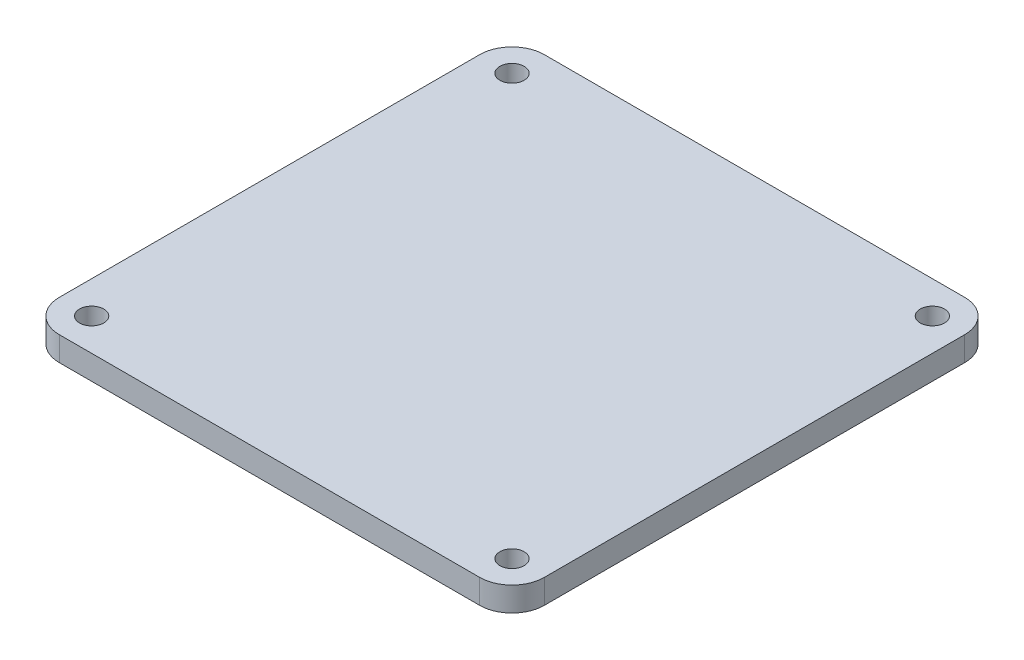
ISO-10303-21;
HEADER;
FILE_DESCRIPTION(('STEP AP214'),'2;1');
FILE_NAME('part.step','',(''),(''),'','','');
FILE_SCHEMA(('AUTOMOTIVE_DESIGN { 1 0 10303 214 1 1 1 1 }'));
ENDSEC;
DATA;
#1=APPLICATION_CONTEXT('core data for automotive mechanical design processes');
#2=APPLICATION_PROTOCOL_DEFINITION('international standard','automotive_design',2000,#1);
#3=PRODUCT_CONTEXT('',#1,'mechanical');
#4=PRODUCT('Part','Part','',(#3));
#5=PRODUCT_RELATED_PRODUCT_CATEGORY('part','',(#4));
#6=PRODUCT_DEFINITION_FORMATION('','',#4);
#7=PRODUCT_DEFINITION_CONTEXT('part definition',#1,'design');
#8=PRODUCT_DEFINITION('design','',#6,#7);
#9=PRODUCT_DEFINITION_SHAPE('','',#8);
#10=(LENGTH_UNIT() NAMED_UNIT(*) SI_UNIT(.MILLI.,.METRE.));
#11=(NAMED_UNIT(*) PLANE_ANGLE_UNIT() SI_UNIT($,.RADIAN.));
#12=(NAMED_UNIT(*) SI_UNIT($,.STERADIAN.) SOLID_ANGLE_UNIT());
#13=UNCERTAINTY_MEASURE_WITH_UNIT(LENGTH_MEASURE(1.E-05),#10,'distance_accuracy_value','');
#14=(GEOMETRIC_REPRESENTATION_CONTEXT(3) GLOBAL_UNCERTAINTY_ASSIGNED_CONTEXT((#13)) GLOBAL_UNIT_ASSIGNED_CONTEXT((#10,
#11,#12)) REPRESENTATION_CONTEXT('',''));
#15=CARTESIAN_POINT('',(0.,0.,0.));
#16=DIRECTION('',(0.,0.,1.));
#17=DIRECTION('',(1.,0.,0.));
#18=AXIS2_PLACEMENT_3D('',#15,#16,#17);
#19=CARTESIAN_POINT('',(-26.,3.,26.));
#20=DIRECTION('',(0.,-1.,0.));
#21=DIRECTION('',(0.,0.,-1.));
#22=AXIS2_PLACEMENT_3D('',#19,#20,#21);
#23=PLANE('',#22);
#24=CARTESIAN_POINT('',(-26.,3.,26.));
#25=DIRECTION('',(0.,1.,0.));
#26=DIRECTION('',(0.,0.,-1.));
#27=AXIS2_PLACEMENT_3D('',#24,#25,#26);
#28=CIRCLE('',#27,4.);
#29=CARTESIAN_POINT('',(-30.,3.,26.));
#30=VERTEX_POINT('',#29);
#31=CARTESIAN_POINT('',(-26.,3.,30.));
#32=VERTEX_POINT('',#31);
#33=EDGE_CURVE('E154',#30,#32,#28,.T.);
#34=ORIENTED_EDGE('',*,*,#33,.T.);
#35=DIRECTION('',(1.,0.,0.));
#36=VECTOR('',#35,1.);
#37=CARTESIAN_POINT('',(-26.,3.,30.));
#38=LINE('',#37,#36);
#39=CARTESIAN_POINT('',(26.,3.,30.));
#40=VERTEX_POINT('',#39);
#41=EDGE_CURVE('E102',#32,#40,#38,.T.);
#42=ORIENTED_EDGE('',*,*,#41,.T.);
#43=CARTESIAN_POINT('',(26.,3.,26.));
#44=DIRECTION('',(0.,1.,0.));
#45=DIRECTION('',(0.,0.,1.));
#46=AXIS2_PLACEMENT_3D('',#43,#44,#45);
#47=CIRCLE('',#46,4.);
#48=CARTESIAN_POINT('',(30.,3.,26.));
#49=VERTEX_POINT('',#48);
#50=EDGE_CURVE('E169',#40,#49,#47,.T.);
#51=ORIENTED_EDGE('',*,*,#50,.T.);
#52=DIRECTION('',(0.,0.,-1.));
#53=VECTOR('',#52,1.);
#54=CARTESIAN_POINT('',(30.,3.,26.));
#55=LINE('',#54,#53);
#56=CARTESIAN_POINT('',(30.,3.,-26.));
#57=VERTEX_POINT('',#56);
#58=EDGE_CURVE('E182',#49,#57,#55,.T.);
#59=ORIENTED_EDGE('',*,*,#58,.T.);
#60=CARTESIAN_POINT('',(26.,3.,-26.));
#61=DIRECTION('',(0.,1.,0.));
#62=DIRECTION('',(0.,0.,-1.));
#63=AXIS2_PLACEMENT_3D('',#60,#61,#62);
#64=CIRCLE('',#63,4.);
#65=CARTESIAN_POINT('',(26.,3.,-30.));
#66=VERTEX_POINT('',#65);
#67=EDGE_CURVE('E121',#57,#66,#64,.T.);
#68=ORIENTED_EDGE('',*,*,#67,.T.);
#69=DIRECTION('',(-1.,0.,0.));
#70=VECTOR('',#69,1.);
#71=CARTESIAN_POINT('',(-26.,3.,-30.));
#72=LINE('',#71,#70);
#73=CARTESIAN_POINT('',(-26.,3.,-30.));
#74=VERTEX_POINT('',#73);
#75=EDGE_CURVE('E115',#66,#74,#72,.T.);
#76=ORIENTED_EDGE('',*,*,#75,.T.);
#77=CARTESIAN_POINT('',(-26.,3.,-26.));
#78=DIRECTION('',(0.,1.,0.));
#79=DIRECTION('',(0.,0.,-1.));
#80=AXIS2_PLACEMENT_3D('',#77,#78,#79);
#81=CIRCLE('',#80,4.);
#82=CARTESIAN_POINT('',(-30.,3.,-26.));
#83=VERTEX_POINT('',#82);
#84=EDGE_CURVE('E119',#74,#83,#81,.T.);
#85=ORIENTED_EDGE('',*,*,#84,.T.);
#86=DIRECTION('',(0.,0.,1.));
#87=VECTOR('',#86,1.);
#88=CARTESIAN_POINT('',(-30.,3.,26.));
#89=LINE('',#88,#87);
#90=EDGE_CURVE('E59',#83,#30,#89,.T.);
#91=ORIENTED_EDGE('',*,*,#90,.T.);
#92=EDGE_LOOP('',(#34,#42,#51,#59,#68,#76,#85,#91));
#93=FACE_BOUND('',#92,.T.);
#94=CARTESIAN_POINT('',(-26.,3.,-26.));
#95=DIRECTION('',(0.,1.,0.));
#96=DIRECTION('',(0.,0.,1.));
#97=AXIS2_PLACEMENT_3D('',#94,#95,#96);
#98=CIRCLE('',#97,1.5);
#99=CARTESIAN_POINT('',(-26.,3.,-24.5));
#100=VERTEX_POINT('',#99);
#101=EDGE_CURVE('E143',#100,#100,#98,.T.);
#102=ORIENTED_EDGE('',*,*,#101,.F.);
#103=EDGE_LOOP('',(#102));
#104=FACE_BOUND('',#103,.T.);
#105=CARTESIAN_POINT('',(26.0000000000001,3.,-25.9999999999999));
#106=DIRECTION('',(0.,1.,0.));
#107=DIRECTION('',(0.,0.,1.));
#108=AXIS2_PLACEMENT_3D('',#105,#106,#107);
#109=CIRCLE('',#108,1.5);
#110=CARTESIAN_POINT('',(26.0000000000001,3.,-24.4999999999999));
#111=VERTEX_POINT('',#110);
#112=EDGE_CURVE('E191',#111,#111,#109,.T.);
#113=ORIENTED_EDGE('',*,*,#112,.F.);
#114=EDGE_LOOP('',(#113));
#115=FACE_BOUND('',#114,.T.);
#116=CARTESIAN_POINT('',(25.9999999999998,3.,26.0000000000002));
#117=DIRECTION('',(0.,1.,0.));
#118=DIRECTION('',(0.,0.,1.));
#119=AXIS2_PLACEMENT_3D('',#116,#117,#118);
#120=CIRCLE('',#119,1.5);
#121=CARTESIAN_POINT('',(25.9999999999998,3.,27.5000000000002));
#122=VERTEX_POINT('',#121);
#123=EDGE_CURVE('E197',#122,#122,#120,.T.);
#124=ORIENTED_EDGE('',*,*,#123,.F.);
#125=EDGE_LOOP('',(#124));
#126=FACE_BOUND('',#125,.T.);
#127=CARTESIAN_POINT('',(-26.0000000000003,3.,25.9999999999997));
#128=DIRECTION('',(0.,1.,0.));
#129=DIRECTION('',(0.,0.,1.));
#130=AXIS2_PLACEMENT_3D('',#127,#128,#129);
#131=CIRCLE('',#130,1.5);
#132=CARTESIAN_POINT('',(-26.0000000000003,3.,27.4999999999997));
#133=VERTEX_POINT('',#132);
#134=EDGE_CURVE('E203',#133,#133,#131,.T.);
#135=ORIENTED_EDGE('',*,*,#134,.F.);
#136=EDGE_LOOP('',(#135));
#137=FACE_BOUND('',#136,.T.);
#138=ADVANCED_FACE('F42',(#93,#104,#115,#126,#137),#23,.F.);
#139=CARTESIAN_POINT('',(-26.,0.,26.));
#140=DIRECTION('',(0.,-1.,0.));
#141=DIRECTION('',(0.,0.,-1.));
#142=AXIS2_PLACEMENT_3D('',#139,#140,#141);
#143=PLANE('',#142);
#144=CARTESIAN_POINT('',(25.9999999999998,0.,26.0000000000002));
#145=DIRECTION('',(0.,1.,0.));
#146=DIRECTION('',(0.,0.,1.));
#147=AXIS2_PLACEMENT_3D('',#144,#145,#146);
#148=CIRCLE('',#147,1.5);
#149=CARTESIAN_POINT('',(25.9999999999998,0.,27.5000000000002));
#150=VERTEX_POINT('',#149);
#151=EDGE_CURVE('E200',#150,#150,#148,.T.);
#152=ORIENTED_EDGE('',*,*,#151,.T.);
#153=EDGE_LOOP('',(#152));
#154=FACE_BOUND('',#153,.T.);
#155=CARTESIAN_POINT('',(-26.,0.,-26.));
#156=DIRECTION('',(0.,1.,0.));
#157=DIRECTION('',(0.,0.,1.));
#158=AXIS2_PLACEMENT_3D('',#155,#156,#157);
#159=CIRCLE('',#158,1.5);
#160=CARTESIAN_POINT('',(-26.,0.,-24.5));
#161=VERTEX_POINT('',#160);
#162=EDGE_CURVE('E188',#161,#161,#159,.T.);
#163=ORIENTED_EDGE('',*,*,#162,.T.);
#164=EDGE_LOOP('',(#163));
#165=FACE_BOUND('',#164,.T.);
#166=CARTESIAN_POINT('',(-26.,0.,26.));
#167=DIRECTION('',(0.,1.,0.));
#168=DIRECTION('',(0.,0.,-1.));
#169=AXIS2_PLACEMENT_3D('',#166,#167,#168);
#170=CIRCLE('',#169,4.);
#171=CARTESIAN_POINT('',(-30.,0.,26.));
#172=VERTEX_POINT('',#171);
#173=CARTESIAN_POINT('',(-26.,0.,30.));
#174=VERTEX_POINT('',#173);
#175=EDGE_CURVE('E139',#172,#174,#170,.T.);
#176=ORIENTED_EDGE('',*,*,#175,.F.);
#177=DIRECTION('',(0.,0.,1.));
#178=VECTOR('',#177,1.);
#179=CARTESIAN_POINT('',(-30.,0.,26.));
#180=LINE('',#179,#178);
#181=CARTESIAN_POINT('',(-30.,0.,-26.));
#182=VERTEX_POINT('',#181);
#183=EDGE_CURVE('E94',#182,#172,#180,.T.);
#184=ORIENTED_EDGE('',*,*,#183,.F.);
#185=CARTESIAN_POINT('',(-26.,0.,-26.));
#186=DIRECTION('',(0.,1.,0.));
#187=DIRECTION('',(0.,0.,-1.));
#188=AXIS2_PLACEMENT_3D('',#185,#186,#187);
#189=CIRCLE('',#188,4.);
#190=CARTESIAN_POINT('',(-26.,0.,-30.));
#191=VERTEX_POINT('',#190);
#192=EDGE_CURVE('E88',#191,#182,#189,.T.);
#193=ORIENTED_EDGE('',*,*,#192,.F.);
#194=DIRECTION('',(-1.,0.,0.));
#195=VECTOR('',#194,1.);
#196=CARTESIAN_POINT('',(-26.,0.,-30.));
#197=LINE('',#196,#195);
#198=CARTESIAN_POINT('',(26.,0.,-30.));
#199=VERTEX_POINT('',#198);
#200=EDGE_CURVE('E129',#199,#191,#197,.T.);
#201=ORIENTED_EDGE('',*,*,#200,.F.);
#202=CARTESIAN_POINT('',(26.,0.,-26.));
#203=DIRECTION('',(0.,1.,0.));
#204=DIRECTION('',(0.,0.,-1.));
#205=AXIS2_PLACEMENT_3D('',#202,#203,#204);
#206=CIRCLE('',#205,4.);
#207=CARTESIAN_POINT('',(30.,0.,-26.));
#208=VERTEX_POINT('',#207);
#209=EDGE_CURVE('E149',#208,#199,#206,.T.);
#210=ORIENTED_EDGE('',*,*,#209,.F.);
#211=DIRECTION('',(0.,0.,-1.));
#212=VECTOR('',#211,1.);
#213=CARTESIAN_POINT('',(30.,0.,26.));
#214=LINE('',#213,#212);
#215=CARTESIAN_POINT('',(30.,0.,26.));
#216=VERTEX_POINT('',#215);
#217=EDGE_CURVE('E147',#216,#208,#214,.T.);
#218=ORIENTED_EDGE('',*,*,#217,.F.);
#219=CARTESIAN_POINT('',(26.,0.,26.));
#220=DIRECTION('',(0.,1.,0.));
#221=DIRECTION('',(0.,0.,1.));
#222=AXIS2_PLACEMENT_3D('',#219,#220,#221);
#223=CIRCLE('',#222,4.);
#224=CARTESIAN_POINT('',(26.,0.,30.));
#225=VERTEX_POINT('',#224);
#226=EDGE_CURVE('E145',#225,#216,#223,.T.);
#227=ORIENTED_EDGE('',*,*,#226,.F.);
#228=DIRECTION('',(1.,0.,0.));
#229=VECTOR('',#228,1.);
#230=CARTESIAN_POINT('',(-26.,0.,30.));
#231=LINE('',#230,#229);
#232=EDGE_CURVE('E142',#174,#225,#231,.T.);
#233=ORIENTED_EDGE('',*,*,#232,.F.);
#234=EDGE_LOOP('',(#176,#184,#193,#201,#210,#218,#227,#233));
#235=FACE_BOUND('',#234,.T.);
#236=CARTESIAN_POINT('',(26.0000000000001,0.,-25.9999999999999));
#237=DIRECTION('',(0.,1.,0.));
#238=DIRECTION('',(0.,0.,1.));
#239=AXIS2_PLACEMENT_3D('',#236,#237,#238);
#240=CIRCLE('',#239,1.5);
#241=CARTESIAN_POINT('',(26.0000000000001,0.,-24.4999999999999));
#242=VERTEX_POINT('',#241);
#243=EDGE_CURVE('E194',#242,#242,#240,.T.);
#244=ORIENTED_EDGE('',*,*,#243,.T.);
#245=EDGE_LOOP('',(#244));
#246=FACE_BOUND('',#245,.T.);
#247=CARTESIAN_POINT('',(-26.0000000000003,0.,25.9999999999997));
#248=DIRECTION('',(0.,1.,0.));
#249=DIRECTION('',(0.,0.,1.));
#250=AXIS2_PLACEMENT_3D('',#247,#248,#249);
#251=CIRCLE('',#250,1.5);
#252=CARTESIAN_POINT('',(-26.0000000000003,0.,27.4999999999997));
#253=VERTEX_POINT('',#252);
#254=EDGE_CURVE('E206',#253,#253,#251,.T.);
#255=ORIENTED_EDGE('',*,*,#254,.T.);
#256=EDGE_LOOP('',(#255));
#257=FACE_BOUND('',#256,.T.);
#258=ADVANCED_FACE('F173',(#154,#165,#235,#246,#257),#143,.T.);
#259=CARTESIAN_POINT('',(-26.,3.,26.));
#260=DIRECTION('',(0.,-1.,0.));
#261=DIRECTION('',(0.,0.,-1.));
#262=AXIS2_PLACEMENT_3D('',#259,#260,#261);
#263=CYLINDRICAL_SURFACE('',#262,4.);
#264=ORIENTED_EDGE('',*,*,#175,.T.);
#265=DIRECTION('',(0.,-1.,0.));
#266=VECTOR('',#265,1.);
#267=CARTESIAN_POINT('',(-26.,3.,30.));
#268=LINE('',#267,#266);
#269=EDGE_CURVE('E11',#32,#174,#268,.T.);
#270=ORIENTED_EDGE('',*,*,#269,.F.);
#271=ORIENTED_EDGE('',*,*,#33,.F.);
#272=DIRECTION('',(0.,-1.,0.));
#273=VECTOR('',#272,1.);
#274=CARTESIAN_POINT('',(-30.,3.,26.));
#275=LINE('',#274,#273);
#276=EDGE_CURVE('E135',#30,#172,#275,.T.);
#277=ORIENTED_EDGE('',*,*,#276,.T.);
#278=EDGE_LOOP('',(#264,#270,#271,#277));
#279=FACE_BOUND('',#278,.T.);
#280=ADVANCED_FACE('F44',(#279),#263,.T.);
#281=CARTESIAN_POINT('',(-26.,3.,30.));
#282=DIRECTION('',(0.,0.,-1.));
#283=DIRECTION('',(-1.,0.,0.));
#284=AXIS2_PLACEMENT_3D('',#281,#282,#283);
#285=PLANE('',#284);
#286=ORIENTED_EDGE('',*,*,#232,.T.);
#287=DIRECTION('',(0.,-1.,0.));
#288=VECTOR('',#287,1.);
#289=CARTESIAN_POINT('',(26.,3.,30.));
#290=LINE('',#289,#288);
#291=EDGE_CURVE('E51',#40,#225,#290,.T.);
#292=ORIENTED_EDGE('',*,*,#291,.F.);
#293=ORIENTED_EDGE('',*,*,#41,.F.);
#294=ORIENTED_EDGE('',*,*,#269,.T.);
#295=EDGE_LOOP('',(#286,#292,#293,#294));
#296=FACE_BOUND('',#295,.T.);
#297=ADVANCED_FACE('F238',(#296),#285,.F.);
#298=CARTESIAN_POINT('',(26.,3.,26.));
#299=DIRECTION('',(0.,-1.,0.));
#300=DIRECTION('',(0.,0.,-1.));
#301=AXIS2_PLACEMENT_3D('',#298,#299,#300);
#302=CYLINDRICAL_SURFACE('',#301,4.);
#303=ORIENTED_EDGE('',*,*,#226,.T.);
#304=DIRECTION('',(0.,-1.,0.));
#305=VECTOR('',#304,1.);
#306=CARTESIAN_POINT('',(30.,3.,26.));
#307=LINE('',#306,#305);
#308=EDGE_CURVE('E161',#49,#216,#307,.T.);
#309=ORIENTED_EDGE('',*,*,#308,.F.);
#310=ORIENTED_EDGE('',*,*,#50,.F.);
#311=ORIENTED_EDGE('',*,*,#291,.T.);
#312=EDGE_LOOP('',(#303,#309,#310,#311));
#313=FACE_BOUND('',#312,.T.);
#314=ADVANCED_FACE('F167',(#313),#302,.T.);
#315=CARTESIAN_POINT('',(30.,3.,26.));
#316=DIRECTION('',(-1.,0.,0.));
#317=DIRECTION('',(0.,0.,1.));
#318=AXIS2_PLACEMENT_3D('',#315,#316,#317);
#319=PLANE('',#318);
#320=ORIENTED_EDGE('',*,*,#217,.T.);
#321=DIRECTION('',(0.,-1.,0.));
#322=VECTOR('',#321,1.);
#323=CARTESIAN_POINT('',(30.,3.,-26.));
#324=LINE('',#323,#322);
#325=EDGE_CURVE('E158',#57,#208,#324,.T.);
#326=ORIENTED_EDGE('',*,*,#325,.F.);
#327=ORIENTED_EDGE('',*,*,#58,.F.);
#328=ORIENTED_EDGE('',*,*,#308,.T.);
#329=EDGE_LOOP('',(#320,#326,#327,#328));
#330=FACE_BOUND('',#329,.T.);
#331=ADVANCED_FACE('F178',(#330),#319,.F.);
#332=CARTESIAN_POINT('',(26.,3.,-26.));
#333=DIRECTION('',(0.,-1.,0.));
#334=DIRECTION('',(0.,0.,-1.));
#335=AXIS2_PLACEMENT_3D('',#332,#333,#334);
#336=CYLINDRICAL_SURFACE('',#335,4.);
#337=ORIENTED_EDGE('',*,*,#209,.T.);
#338=DIRECTION('',(0.,-1.,0.));
#339=VECTOR('',#338,1.);
#340=CARTESIAN_POINT('',(26.,3.,-30.));
#341=LINE('',#340,#339);
#342=EDGE_CURVE('E130',#66,#199,#341,.T.);
#343=ORIENTED_EDGE('',*,*,#342,.F.);
#344=ORIENTED_EDGE('',*,*,#67,.F.);
#345=ORIENTED_EDGE('',*,*,#325,.T.);
#346=EDGE_LOOP('',(#337,#343,#344,#345));
#347=FACE_BOUND('',#346,.T.);
#348=ADVANCED_FACE('F181',(#347),#336,.T.);
#349=CARTESIAN_POINT('',(-26.,3.,-30.));
#350=DIRECTION('',(0.,0.,1.));
#351=DIRECTION('',(1.,0.,0.));
#352=AXIS2_PLACEMENT_3D('',#349,#350,#351);
#353=PLANE('',#352);
#354=ORIENTED_EDGE('',*,*,#200,.T.);
#355=DIRECTION('',(0.,-1.,0.));
#356=VECTOR('',#355,1.);
#357=CARTESIAN_POINT('',(-26.,3.,-30.));
#358=LINE('',#357,#356);
#359=EDGE_CURVE('E126',#74,#191,#358,.T.);
#360=ORIENTED_EDGE('',*,*,#359,.F.);
#361=ORIENTED_EDGE('',*,*,#75,.F.);
#362=ORIENTED_EDGE('',*,*,#342,.T.);
#363=EDGE_LOOP('',(#354,#360,#361,#362));
#364=FACE_BOUND('',#363,.T.);
#365=ADVANCED_FACE('F127',(#364),#353,.F.);
#366=CARTESIAN_POINT('',(-26.,3.,-26.));
#367=DIRECTION('',(0.,-1.,0.));
#368=DIRECTION('',(0.,0.,-1.));
#369=AXIS2_PLACEMENT_3D('',#366,#367,#368);
#370=CYLINDRICAL_SURFACE('',#369,4.);
#371=ORIENTED_EDGE('',*,*,#192,.T.);
#372=DIRECTION('',(0.,-1.,0.));
#373=VECTOR('',#372,1.);
#374=CARTESIAN_POINT('',(-30.,3.,-26.));
#375=LINE('',#374,#373);
#376=EDGE_CURVE('E131',#83,#182,#375,.T.);
#377=ORIENTED_EDGE('',*,*,#376,.F.);
#378=ORIENTED_EDGE('',*,*,#84,.F.);
#379=ORIENTED_EDGE('',*,*,#359,.T.);
#380=EDGE_LOOP('',(#371,#377,#378,#379));
#381=FACE_BOUND('',#380,.T.);
#382=ADVANCED_FACE('F133',(#381),#370,.T.);
#383=CARTESIAN_POINT('',(-30.,3.,26.));
#384=DIRECTION('',(1.,0.,0.));
#385=DIRECTION('',(0.,0.,-1.));
#386=AXIS2_PLACEMENT_3D('',#383,#384,#385);
#387=PLANE('',#386);
#388=ORIENTED_EDGE('',*,*,#183,.T.);
#389=ORIENTED_EDGE('',*,*,#276,.F.);
#390=ORIENTED_EDGE('',*,*,#90,.F.);
#391=ORIENTED_EDGE('',*,*,#376,.T.);
#392=EDGE_LOOP('',(#388,#389,#390,#391));
#393=FACE_BOUND('',#392,.T.);
#394=ADVANCED_FACE('F226',(#393),#387,.F.);
#395=CARTESIAN_POINT('',(-26.,3.,-26.));
#396=DIRECTION('',(0.,-1.,0.));
#397=DIRECTION('',(0.,0.,-1.));
#398=AXIS2_PLACEMENT_3D('',#395,#396,#397);
#399=CYLINDRICAL_SURFACE('',#398,1.5);
#400=ORIENTED_EDGE('',*,*,#101,.T.);
#401=EDGE_LOOP('',(#400));
#402=FACE_BOUND('',#401,.T.);
#403=ORIENTED_EDGE('',*,*,#162,.F.);
#404=EDGE_LOOP('',(#403));
#405=FACE_BOUND('',#404,.T.);
#406=ADVANCED_FACE('F223',(#402,#405),#399,.F.);
#407=CARTESIAN_POINT('',(26.0000000000001,3.,-25.9999999999999));
#408=DIRECTION('',(0.,-1.,0.));
#409=DIRECTION('',(0.,0.,-1.));
#410=AXIS2_PLACEMENT_3D('',#407,#408,#409);
#411=CYLINDRICAL_SURFACE('',#410,1.5);
#412=ORIENTED_EDGE('',*,*,#112,.T.);
#413=EDGE_LOOP('',(#412));
#414=FACE_BOUND('',#413,.T.);
#415=ORIENTED_EDGE('',*,*,#243,.F.);
#416=EDGE_LOOP('',(#415));
#417=FACE_BOUND('',#416,.T.);
#418=ADVANCED_FACE('F301',(#414,#417),#411,.F.);
#419=CARTESIAN_POINT('',(25.9999999999998,3.,26.0000000000002));
#420=DIRECTION('',(0.,-1.,0.));
#421=DIRECTION('',(0.,0.,-1.));
#422=AXIS2_PLACEMENT_3D('',#419,#420,#421);
#423=CYLINDRICAL_SURFACE('',#422,1.5);
#424=ORIENTED_EDGE('',*,*,#123,.T.);
#425=EDGE_LOOP('',(#424));
#426=FACE_BOUND('',#425,.T.);
#427=ORIENTED_EDGE('',*,*,#151,.F.);
#428=EDGE_LOOP('',(#427));
#429=FACE_BOUND('',#428,.T.);
#430=ADVANCED_FACE('F309',(#426,#429),#423,.F.);
#431=CARTESIAN_POINT('',(-26.0000000000003,3.,25.9999999999997));
#432=DIRECTION('',(0.,-1.,0.));
#433=DIRECTION('',(0.,0.,-1.));
#434=AXIS2_PLACEMENT_3D('',#431,#432,#433);
#435=CYLINDRICAL_SURFACE('',#434,1.5);
#436=ORIENTED_EDGE('',*,*,#134,.T.);
#437=EDGE_LOOP('',(#436));
#438=FACE_BOUND('',#437,.T.);
#439=ORIENTED_EDGE('',*,*,#254,.F.);
#440=EDGE_LOOP('',(#439));
#441=FACE_BOUND('',#440,.T.);
#442=ADVANCED_FACE('F212',(#438,#441),#435,.F.);
#443=CLOSED_SHELL('',(#138,#258,#280,#297,#314,#331,#348,#365,#382,#394,#406,#418,#430,#442));
#444=MANIFOLD_SOLID_BREP('B2',#443);
#445=ADVANCED_BREP_SHAPE_REPRESENTATION('',(#18,#444),#14);
#446=SHAPE_DEFINITION_REPRESENTATION(#9,#445);
ENDSEC;
END-ISO-10303-21;
